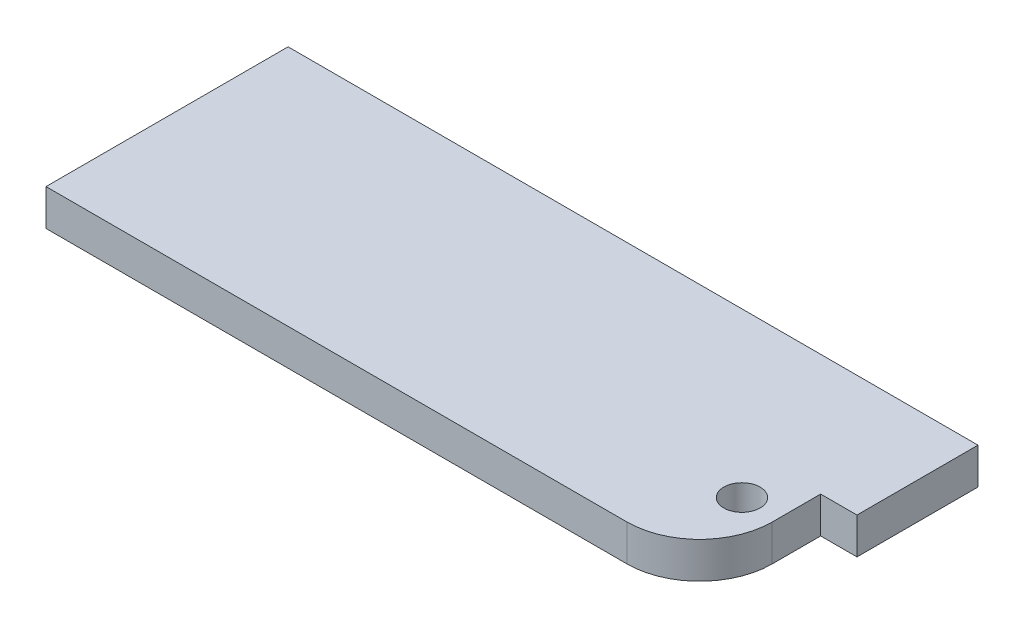
ISO-10303-21;
HEADER;
FILE_DESCRIPTION(('STEP AP214'),'2;1');
FILE_NAME('part.step','',(''),(''),'','','');
FILE_SCHEMA(('AUTOMOTIVE_DESIGN { 1 0 10303 214 1 1 1 1 }'));
ENDSEC;
DATA;
#1=APPLICATION_CONTEXT('core data for automotive mechanical design processes');
#2=APPLICATION_PROTOCOL_DEFINITION('international standard','automotive_design',2000,#1);
#3=PRODUCT_CONTEXT('',#1,'mechanical');
#4=PRODUCT('Part','Part','',(#3));
#5=PRODUCT_RELATED_PRODUCT_CATEGORY('part','',(#4));
#6=PRODUCT_DEFINITION_FORMATION('','',#4);
#7=PRODUCT_DEFINITION_CONTEXT('part definition',#1,'design');
#8=PRODUCT_DEFINITION('design','',#6,#7);
#9=PRODUCT_DEFINITION_SHAPE('','',#8);
#10=(LENGTH_UNIT() NAMED_UNIT(*) SI_UNIT(.MILLI.,.METRE.));
#11=(NAMED_UNIT(*) PLANE_ANGLE_UNIT() SI_UNIT($,.RADIAN.));
#12=(NAMED_UNIT(*) SI_UNIT($,.STERADIAN.) SOLID_ANGLE_UNIT());
#13=UNCERTAINTY_MEASURE_WITH_UNIT(LENGTH_MEASURE(1.E-05),#10,'distance_accuracy_value','');
#14=(GEOMETRIC_REPRESENTATION_CONTEXT(3) GLOBAL_UNCERTAINTY_ASSIGNED_CONTEXT((#13)) GLOBAL_UNIT_ASSIGNED_CONTEXT((#10,
#11,#12)) REPRESENTATION_CONTEXT('',''));
#15=CARTESIAN_POINT('',(0.,0.,0.));
#16=DIRECTION('',(0.,0.,1.));
#17=DIRECTION('',(1.,0.,0.));
#18=AXIS2_PLACEMENT_3D('',#15,#16,#17);
#19=CARTESIAN_POINT('',(21.,3.,4.));
#20=DIRECTION('',(0.,1.,0.));
#21=DIRECTION('',(0.,0.,1.));
#22=AXIS2_PLACEMENT_3D('',#19,#20,#21);
#23=PLANE('',#22);
#24=DIRECTION('',(0.,0.,1.));
#25=VECTOR('',#24,1.);
#26=CARTESIAN_POINT('',(-27.,3.,-10.));
#27=LINE('',#26,#25);
#28=CARTESIAN_POINT('',(-27.,3.,-10.));
#29=VERTEX_POINT('',#28);
#30=CARTESIAN_POINT('',(-27.,3.,10.));
#31=VERTEX_POINT('',#30);
#32=EDGE_CURVE('E139',#29,#31,#27,.T.);
#33=ORIENTED_EDGE('',*,*,#32,.T.);
#34=DIRECTION('',(1.,0.,0.));
#35=VECTOR('',#34,1.);
#36=CARTESIAN_POINT('',(21.,3.,9.99999999999999));
#37=LINE('',#36,#35);
#38=CARTESIAN_POINT('',(21.,3.,9.99999999999999));
#39=VERTEX_POINT('',#38);
#40=EDGE_CURVE('E88',#31,#39,#37,.T.);
#41=ORIENTED_EDGE('',*,*,#40,.T.);
#42=CARTESIAN_POINT('',(21.,3.,4.));
#43=DIRECTION('',(0.,1.,0.));
#44=DIRECTION('',(0.,0.,1.));
#45=AXIS2_PLACEMENT_3D('',#42,#43,#44);
#46=CIRCLE('',#45,6.);
#47=CARTESIAN_POINT('',(27.,3.,3.99999999999999));
#48=VERTEX_POINT('',#47);
#49=EDGE_CURVE('E151',#39,#48,#46,.T.);
#50=ORIENTED_EDGE('',*,*,#49,.T.);
#51=DIRECTION('',(0.,0.,-1.));
#52=VECTOR('',#51,1.);
#53=CARTESIAN_POINT('',(27.,3.,0.));
#54=LINE('',#53,#52);
#55=CARTESIAN_POINT('',(27.,3.,0.));
#56=VERTEX_POINT('',#55);
#57=EDGE_CURVE('E105',#48,#56,#54,.T.);
#58=ORIENTED_EDGE('',*,*,#57,.T.);
#59=DIRECTION('',(1.,0.,0.));
#60=VECTOR('',#59,1.);
#61=CARTESIAN_POINT('',(27.,3.,0.));
#62=LINE('',#61,#60);
#63=CARTESIAN_POINT('',(30.,3.,0.));
#64=VERTEX_POINT('',#63);
#65=EDGE_CURVE('E98',#56,#64,#62,.T.);
#66=ORIENTED_EDGE('',*,*,#65,.T.);
#67=DIRECTION('',(0.,0.,-1.));
#68=VECTOR('',#67,1.);
#69=CARTESIAN_POINT('',(30.,3.,-10.));
#70=LINE('',#69,#68);
#71=CARTESIAN_POINT('',(30.,3.,-10.));
#72=VERTEX_POINT('',#71);
#73=EDGE_CURVE('E102',#64,#72,#70,.T.);
#74=ORIENTED_EDGE('',*,*,#73,.T.);
#75=DIRECTION('',(-1.,0.,0.));
#76=VECTOR('',#75,1.);
#77=CARTESIAN_POINT('',(27.,3.,-10.));
#78=LINE('',#77,#76);
#79=EDGE_CURVE('E50',#72,#29,#78,.T.);
#80=ORIENTED_EDGE('',*,*,#79,.T.);
#81=EDGE_LOOP('',(#33,#41,#50,#58,#66,#74,#80));
#82=FACE_BOUND('',#81,.T.);
#83=CARTESIAN_POINT('',(24.,3.,3.49999999999999));
#84=DIRECTION('',(0.,1.,0.));
#85=DIRECTION('',(0.,0.,1.));
#86=AXIS2_PLACEMENT_3D('',#83,#84,#85);
#87=CIRCLE('',#86,1.5);
#88=CARTESIAN_POINT('',(24.,3.,5.));
#89=VERTEX_POINT('',#88);
#90=EDGE_CURVE('E129',#89,#89,#87,.T.);
#91=ORIENTED_EDGE('',*,*,#90,.F.);
#92=EDGE_LOOP('',(#91));
#93=FACE_BOUND('',#92,.T.);
#94=ADVANCED_FACE('F33',(#82,#93),#23,.T.);
#95=CARTESIAN_POINT('',(21.,0.,4.));
#96=DIRECTION('',(0.,1.,0.));
#97=DIRECTION('',(0.,0.,1.));
#98=AXIS2_PLACEMENT_3D('',#95,#96,#97);
#99=PLANE('',#98);
#100=DIRECTION('',(0.,0.,1.));
#101=VECTOR('',#100,1.);
#102=CARTESIAN_POINT('',(-27.,0.,-10.));
#103=LINE('',#102,#101);
#104=CARTESIAN_POINT('',(-27.,0.,-10.));
#105=VERTEX_POINT('',#104);
#106=CARTESIAN_POINT('',(-27.,0.,10.));
#107=VERTEX_POINT('',#106);
#108=EDGE_CURVE('E125',#105,#107,#103,.T.);
#109=ORIENTED_EDGE('',*,*,#108,.F.);
#110=DIRECTION('',(-1.,0.,0.));
#111=VECTOR('',#110,1.);
#112=CARTESIAN_POINT('',(27.,0.,-10.));
#113=LINE('',#112,#111);
#114=CARTESIAN_POINT('',(30.,0.,-10.));
#115=VERTEX_POINT('',#114);
#116=EDGE_CURVE('E76',#115,#105,#113,.T.);
#117=ORIENTED_EDGE('',*,*,#116,.F.);
#118=DIRECTION('',(0.,0.,-1.));
#119=VECTOR('',#118,1.);
#120=CARTESIAN_POINT('',(30.,0.,-10.));
#121=LINE('',#120,#119);
#122=CARTESIAN_POINT('',(30.,0.,0.));
#123=VERTEX_POINT('',#122);
#124=EDGE_CURVE('E136',#123,#115,#121,.T.);
#125=ORIENTED_EDGE('',*,*,#124,.F.);
#126=DIRECTION('',(1.,0.,0.));
#127=VECTOR('',#126,1.);
#128=CARTESIAN_POINT('',(27.,0.,0.));
#129=LINE('',#128,#127);
#130=CARTESIAN_POINT('',(27.,0.,0.));
#131=VERTEX_POINT('',#130);
#132=EDGE_CURVE('E114',#131,#123,#129,.T.);
#133=ORIENTED_EDGE('',*,*,#132,.F.);
#134=DIRECTION('',(0.,0.,-1.));
#135=VECTOR('',#134,1.);
#136=CARTESIAN_POINT('',(27.,0.,0.));
#137=LINE('',#136,#135);
#138=CARTESIAN_POINT('',(27.,0.,3.99999999999999));
#139=VERTEX_POINT('',#138);
#140=EDGE_CURVE('E133',#139,#131,#137,.T.);
#141=ORIENTED_EDGE('',*,*,#140,.F.);
#142=CARTESIAN_POINT('',(21.,0.,4.));
#143=DIRECTION('',(0.,1.,0.));
#144=DIRECTION('',(0.,0.,1.));
#145=AXIS2_PLACEMENT_3D('',#142,#143,#144);
#146=CIRCLE('',#145,6.);
#147=CARTESIAN_POINT('',(21.,0.,9.99999999999999));
#148=VERTEX_POINT('',#147);
#149=EDGE_CURVE('E131',#148,#139,#146,.T.);
#150=ORIENTED_EDGE('',*,*,#149,.F.);
#151=DIRECTION('',(1.,0.,0.));
#152=VECTOR('',#151,1.);
#153=CARTESIAN_POINT('',(21.,0.,9.99999999999999));
#154=LINE('',#153,#152);
#155=EDGE_CURVE('E128',#107,#148,#154,.T.);
#156=ORIENTED_EDGE('',*,*,#155,.F.);
#157=EDGE_LOOP('',(#109,#117,#125,#133,#141,#150,#156));
#158=FACE_BOUND('',#157,.T.);
#159=CARTESIAN_POINT('',(24.,0.,3.49999999999999));
#160=DIRECTION('',(0.,1.,0.));
#161=DIRECTION('',(0.,0.,1.));
#162=AXIS2_PLACEMENT_3D('',#159,#160,#161);
#163=CIRCLE('',#162,1.5);
#164=CARTESIAN_POINT('',(24.,0.,5.));
#165=VERTEX_POINT('',#164);
#166=EDGE_CURVE('E161',#165,#165,#163,.T.);
#167=ORIENTED_EDGE('',*,*,#166,.T.);
#168=EDGE_LOOP('',(#167));
#169=FACE_BOUND('',#168,.T.);
#170=ADVANCED_FACE('F153',(#158,#169),#99,.F.);
#171=CARTESIAN_POINT('',(-27.,3.,-10.));
#172=DIRECTION('',(1.,0.,0.));
#173=DIRECTION('',(0.,0.,-1.));
#174=AXIS2_PLACEMENT_3D('',#171,#172,#173);
#175=PLANE('',#174);
#176=ORIENTED_EDGE('',*,*,#108,.T.);
#177=DIRECTION('',(0.,-1.,0.));
#178=VECTOR('',#177,1.);
#179=CARTESIAN_POINT('',(-27.,3.,10.));
#180=LINE('',#179,#178);
#181=EDGE_CURVE('E11',#31,#107,#180,.T.);
#182=ORIENTED_EDGE('',*,*,#181,.F.);
#183=ORIENTED_EDGE('',*,*,#32,.F.);
#184=DIRECTION('',(0.,-1.,0.));
#185=VECTOR('',#184,1.);
#186=CARTESIAN_POINT('',(-27.,3.,-10.));
#187=LINE('',#186,#185);
#188=EDGE_CURVE('E121',#29,#105,#187,.T.);
#189=ORIENTED_EDGE('',*,*,#188,.T.);
#190=EDGE_LOOP('',(#176,#182,#183,#189));
#191=FACE_BOUND('',#190,.T.);
#192=ADVANCED_FACE('F35',(#191),#175,.F.);
#193=CARTESIAN_POINT('',(21.,3.,9.99999999999999));
#194=DIRECTION('',(0.,0.,-1.));
#195=DIRECTION('',(-1.,0.,0.));
#196=AXIS2_PLACEMENT_3D('',#193,#194,#195);
#197=PLANE('',#196);
#198=ORIENTED_EDGE('',*,*,#155,.T.);
#199=DIRECTION('',(0.,-1.,0.));
#200=VECTOR('',#199,1.);
#201=CARTESIAN_POINT('',(21.,3.,9.99999999999999));
#202=LINE('',#201,#200);
#203=EDGE_CURVE('E42',#39,#148,#202,.T.);
#204=ORIENTED_EDGE('',*,*,#203,.F.);
#205=ORIENTED_EDGE('',*,*,#40,.F.);
#206=ORIENTED_EDGE('',*,*,#181,.T.);
#207=EDGE_LOOP('',(#198,#204,#205,#206));
#208=FACE_BOUND('',#207,.T.);
#209=ADVANCED_FACE('F187',(#208),#197,.F.);
#210=CARTESIAN_POINT('',(21.,3.,4.));
#211=DIRECTION('',(0.,-1.,0.));
#212=DIRECTION('',(0.,0.,-1.));
#213=AXIS2_PLACEMENT_3D('',#210,#211,#212);
#214=CYLINDRICAL_SURFACE('',#213,6.);
#215=ORIENTED_EDGE('',*,*,#149,.T.);
#216=DIRECTION('',(0.,-1.,0.));
#217=VECTOR('',#216,1.);
#218=CARTESIAN_POINT('',(27.,3.,3.99999999999999));
#219=LINE('',#218,#217);
#220=EDGE_CURVE('E143',#48,#139,#219,.T.);
#221=ORIENTED_EDGE('',*,*,#220,.F.);
#222=ORIENTED_EDGE('',*,*,#49,.F.);
#223=ORIENTED_EDGE('',*,*,#203,.T.);
#224=EDGE_LOOP('',(#215,#221,#222,#223));
#225=FACE_BOUND('',#224,.T.);
#226=ADVANCED_FACE('F149',(#225),#214,.T.);
#227=CARTESIAN_POINT('',(27.,3.,0.));
#228=DIRECTION('',(-1.,0.,0.));
#229=DIRECTION('',(0.,0.,1.));
#230=AXIS2_PLACEMENT_3D('',#227,#228,#229);
#231=PLANE('',#230);
#232=ORIENTED_EDGE('',*,*,#140,.T.);
#233=DIRECTION('',(0.,-1.,0.));
#234=VECTOR('',#233,1.);
#235=CARTESIAN_POINT('',(27.,3.,0.));
#236=LINE('',#235,#234);
#237=EDGE_CURVE('E116',#56,#131,#236,.T.);
#238=ORIENTED_EDGE('',*,*,#237,.F.);
#239=ORIENTED_EDGE('',*,*,#57,.F.);
#240=ORIENTED_EDGE('',*,*,#220,.T.);
#241=EDGE_LOOP('',(#232,#238,#239,#240));
#242=FACE_BOUND('',#241,.T.);
#243=ADVANCED_FACE('F156',(#242),#231,.F.);
#244=CARTESIAN_POINT('',(27.,3.,0.));
#245=DIRECTION('',(0.,0.,-1.));
#246=DIRECTION('',(-1.,0.,0.));
#247=AXIS2_PLACEMENT_3D('',#244,#245,#246);
#248=PLANE('',#247);
#249=ORIENTED_EDGE('',*,*,#132,.T.);
#250=DIRECTION('',(0.,-1.,0.));
#251=VECTOR('',#250,1.);
#252=CARTESIAN_POINT('',(30.,3.,0.));
#253=LINE('',#252,#251);
#254=EDGE_CURVE('E111',#64,#123,#253,.T.);
#255=ORIENTED_EDGE('',*,*,#254,.F.);
#256=ORIENTED_EDGE('',*,*,#65,.F.);
#257=ORIENTED_EDGE('',*,*,#237,.T.);
#258=EDGE_LOOP('',(#249,#255,#256,#257));
#259=FACE_BOUND('',#258,.T.);
#260=ADVANCED_FACE('F112',(#259),#248,.F.);
#261=CARTESIAN_POINT('',(30.,3.,-10.));
#262=DIRECTION('',(-1.,0.,0.));
#263=DIRECTION('',(0.,0.,1.));
#264=AXIS2_PLACEMENT_3D('',#261,#262,#263);
#265=PLANE('',#264);
#266=ORIENTED_EDGE('',*,*,#124,.T.);
#267=DIRECTION('',(0.,-1.,0.));
#268=VECTOR('',#267,1.);
#269=CARTESIAN_POINT('',(30.,3.,-10.));
#270=LINE('',#269,#268);
#271=EDGE_CURVE('E117',#72,#115,#270,.T.);
#272=ORIENTED_EDGE('',*,*,#271,.F.);
#273=ORIENTED_EDGE('',*,*,#73,.F.);
#274=ORIENTED_EDGE('',*,*,#254,.T.);
#275=EDGE_LOOP('',(#266,#272,#273,#274));
#276=FACE_BOUND('',#275,.T.);
#277=ADVANCED_FACE('F119',(#276),#265,.F.);
#278=CARTESIAN_POINT('',(27.,3.,-10.));
#279=DIRECTION('',(0.,0.,1.));
#280=DIRECTION('',(1.,0.,0.));
#281=AXIS2_PLACEMENT_3D('',#278,#279,#280);
#282=PLANE('',#281);
#283=ORIENTED_EDGE('',*,*,#116,.T.);
#284=ORIENTED_EDGE('',*,*,#188,.F.);
#285=ORIENTED_EDGE('',*,*,#79,.F.);
#286=ORIENTED_EDGE('',*,*,#271,.T.);
#287=EDGE_LOOP('',(#283,#284,#285,#286));
#288=FACE_BOUND('',#287,.T.);
#289=ADVANCED_FACE('F177',(#288),#282,.F.);
#290=CARTESIAN_POINT('',(24.,3.,3.49999999999999));
#291=DIRECTION('',(0.,-1.,0.));
#292=DIRECTION('',(0.,0.,-1.));
#293=AXIS2_PLACEMENT_3D('',#290,#291,#292);
#294=CYLINDRICAL_SURFACE('',#293,1.5);
#295=ORIENTED_EDGE('',*,*,#90,.T.);
#296=EDGE_LOOP('',(#295));
#297=FACE_BOUND('',#296,.T.);
#298=ORIENTED_EDGE('',*,*,#166,.F.);
#299=EDGE_LOOP('',(#298));
#300=FACE_BOUND('',#299,.T.);
#301=ADVANCED_FACE('F167',(#297,#300),#294,.F.);
#302=CLOSED_SHELL('',(#94,#170,#192,#209,#226,#243,#260,#277,#289,#301));
#303=MANIFOLD_SOLID_BREP('B2',#302);
#304=ADVANCED_BREP_SHAPE_REPRESENTATION('',(#18,#303),#14);
#305=SHAPE_DEFINITION_REPRESENTATION(#9,#304);
ENDSEC;
END-ISO-10303-21;
